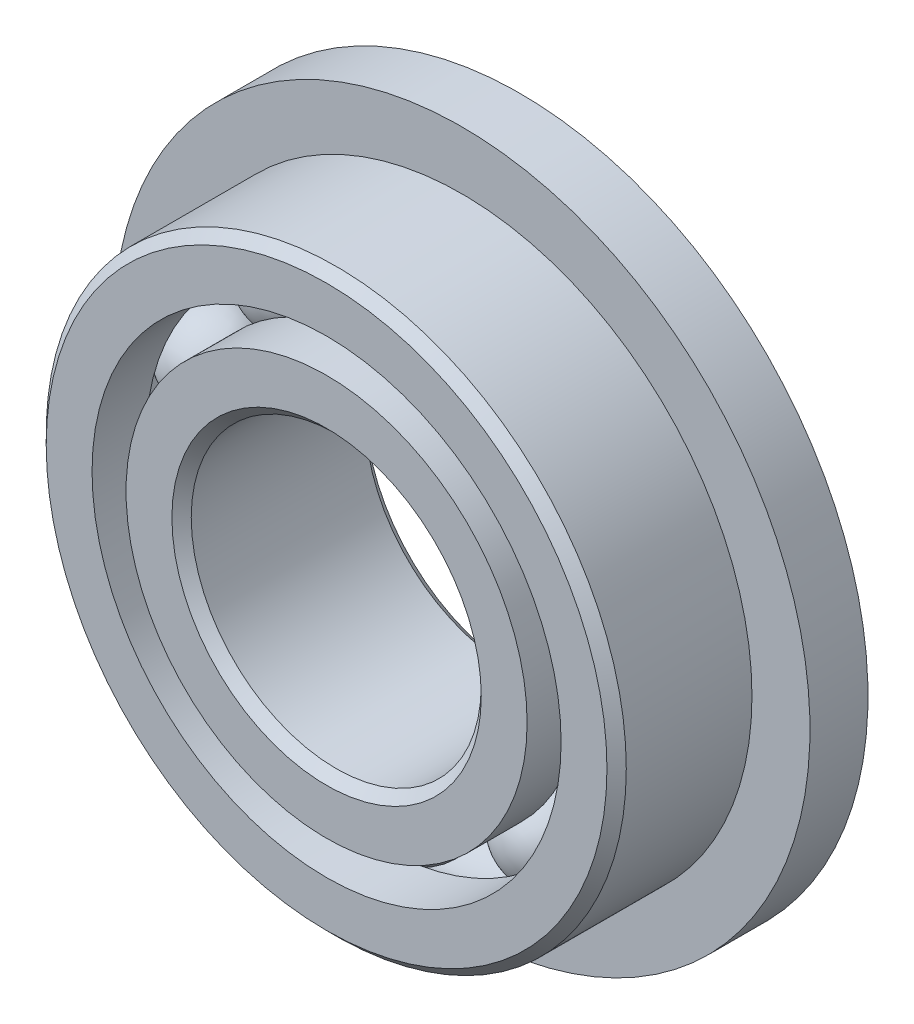
ISO-10303-21;
HEADER;
FILE_DESCRIPTION(('STEP AP214'),'2;1');
FILE_NAME('part.step','',(''),(''),'','','');
FILE_SCHEMA(('AUTOMOTIVE_DESIGN { 1 0 10303 214 1 1 1 1 }'));
ENDSEC;
DATA;
#1=APPLICATION_CONTEXT('core data for automotive mechanical design processes');
#2=APPLICATION_PROTOCOL_DEFINITION('international standard','automotive_design',2000,#1);
#3=PRODUCT_CONTEXT('',#1,'mechanical');
#4=PRODUCT('Part','Part','',(#3));
#5=PRODUCT_RELATED_PRODUCT_CATEGORY('part','',(#4));
#6=PRODUCT_DEFINITION_FORMATION('','',#4);
#7=PRODUCT_DEFINITION_CONTEXT('part definition',#1,'design');
#8=PRODUCT_DEFINITION('design','',#6,#7);
#9=PRODUCT_DEFINITION_SHAPE('','',#8);
#10=(LENGTH_UNIT() NAMED_UNIT(*) SI_UNIT(.MILLI.,.METRE.));
#11=(NAMED_UNIT(*) PLANE_ANGLE_UNIT() SI_UNIT($,.RADIAN.));
#12=(NAMED_UNIT(*) SI_UNIT($,.STERADIAN.) SOLID_ANGLE_UNIT());
#13=UNCERTAINTY_MEASURE_WITH_UNIT(LENGTH_MEASURE(1.E-05),#10,'distance_accuracy_value','');
#14=(GEOMETRIC_REPRESENTATION_CONTEXT(3) GLOBAL_UNCERTAINTY_ASSIGNED_CONTEXT((#13)) GLOBAL_UNIT_ASSIGNED_CONTEXT((#10,
#11,#12)) REPRESENTATION_CONTEXT('',''));
#15=CARTESIAN_POINT('',(0.,0.,0.));
#16=DIRECTION('',(0.,0.,1.));
#17=DIRECTION('',(1.,0.,0.));
#18=AXIS2_PLACEMENT_3D('',#15,#16,#17);
#19=CARTESIAN_POINT('',(-1.32251681765804,1.82028823734365,0.));
#20=DIRECTION('',(0.,0.,1.));
#21=DIRECTION('',(-0.587785252292462,0.809016994374955,0.));
#22=AXIS2_PLACEMENT_3D('',#19,#20,#21);
#23=SPHERICAL_SURFACE('',#22,0.477959208512381);
#24=CARTESIAN_POINT('',(-1.32251681765804,1.82028823734365,0.477959208512381));
#25=VERTEX_POINT('',#24);
#26=VERTEX_LOOP('',#25);
#27=FACE_BOUND('',#26,.T.);
#28=ADVANCED_FACE('F39',(#27),#23,.T.);
#29=CLOSED_SHELL('',(#28));
#30=MANIFOLD_SOLID_BREP('B2',#29);
#31=CARTESIAN_POINT('',(-2.13987716166409,0.695288237343656,0.));
#32=DIRECTION('',(0.,0.,1.));
#33=DIRECTION('',(-0.95105651629515,0.309016994374958,0.));
#34=AXIS2_PLACEMENT_3D('',#31,#32,#33);
#35=SPHERICAL_SURFACE('',#34,0.477959208512381);
#36=CARTESIAN_POINT('',(-2.13987716166409,0.695288237343656,0.477959208512381));
#37=VERTEX_POINT('',#36);
#38=VERTEX_LOOP('',#37);
#39=FACE_BOUND('',#38,.T.);
#40=ADVANCED_FACE('F59',(#39),#35,.T.);
#41=CLOSED_SHELL('',(#40));
#42=MANIFOLD_SOLID_BREP('B6',#41);
#43=CARTESIAN_POINT('',(-2.1398771616641,-0.695288237343611,0.));
#44=DIRECTION('',(0.,0.,1.));
#45=DIRECTION('',(-0.951056516295157,-0.309016994374938,0.));
#46=AXIS2_PLACEMENT_3D('',#43,#44,#45);
#47=SPHERICAL_SURFACE('',#46,0.477959208512381);
#48=CARTESIAN_POINT('',(-2.1398771616641,-0.695288237343611,0.477959208512381));
#49=VERTEX_POINT('',#48);
#50=VERTEX_LOOP('',#49);
#51=FACE_BOUND('',#50,.T.);
#52=ADVANCED_FACE('F79',(#51),#47,.T.);
#53=CLOSED_SHELL('',(#52));
#54=MANIFOLD_SOLID_BREP('B35',#53);
#55=CARTESIAN_POINT('',(-1.32251681765808,-1.82028823734362,0.));
#56=DIRECTION('',(0.,0.,1.));
#57=DIRECTION('',(-0.58778525229248,-0.809016994374942,0.));
#58=AXIS2_PLACEMENT_3D('',#55,#56,#57);
#59=SPHERICAL_SURFACE('',#58,0.477959208512381);
#60=CARTESIAN_POINT('',(-1.32251681765808,-1.82028823734362,0.477959208512381));
#61=VERTEX_POINT('',#60);
#62=VERTEX_LOOP('',#61);
#63=FACE_BOUND('',#62,.T.);
#64=ADVANCED_FACE('F99',(#63),#59,.T.);
#65=CLOSED_SHELL('',(#64));
#66=MANIFOLD_SOLID_BREP('B55',#65);
#67=CARTESIAN_POINT('',(0.,-2.25,0.));
#68=DIRECTION('',(0.,0.,1.));
#69=DIRECTION('',(0.,-1.,0.));
#70=AXIS2_PLACEMENT_3D('',#67,#68,#69);
#71=SPHERICAL_SURFACE('',#70,0.477959208512381);
#72=CARTESIAN_POINT('',(0.,-2.25,0.477959208512381));
#73=VERTEX_POINT('',#72);
#74=VERTEX_LOOP('',#73);
#75=FACE_BOUND('',#74,.T.);
#76=ADVANCED_FACE('F119',(#75),#71,.T.);
#77=CLOSED_SHELL('',(#76));
#78=MANIFOLD_SOLID_BREP('B75',#77);
#79=CARTESIAN_POINT('',(1.32251681765805,-1.82028823734364,0.));
#80=DIRECTION('',(0.,0.,1.));
#81=DIRECTION('',(0.587785252292469,-0.809016994374951,0.));
#82=AXIS2_PLACEMENT_3D('',#79,#80,#81);
#83=SPHERICAL_SURFACE('',#82,0.477959208512381);
#84=CARTESIAN_POINT('',(1.32251681765805,-1.82028823734364,0.477959208512381));
#85=VERTEX_POINT('',#84);
#86=VERTEX_LOOP('',#85);
#87=FACE_BOUND('',#86,.T.);
#88=ADVANCED_FACE('F139',(#87),#83,.T.);
#89=CLOSED_SHELL('',(#88));
#90=MANIFOLD_SOLID_BREP('B95',#89);
#91=CARTESIAN_POINT('',(2.13987716166409,-0.695288237343641,0.));
#92=DIRECTION('',(0.,0.,1.));
#93=DIRECTION('',(0.951056516295152,-0.309016994374952,0.));
#94=AXIS2_PLACEMENT_3D('',#91,#92,#93);
#95=SPHERICAL_SURFACE('',#94,0.477959208512381);
#96=CARTESIAN_POINT('',(2.13987716166409,-0.695288237343641,0.477959208512381));
#97=VERTEX_POINT('',#96);
#98=VERTEX_LOOP('',#97);
#99=FACE_BOUND('',#98,.T.);
#100=ADVANCED_FACE('F159',(#99),#95,.T.);
#101=CLOSED_SHELL('',(#100));
#102=MANIFOLD_SOLID_BREP('B115',#101);
#103=CARTESIAN_POINT('',(2.1398771616641,0.695288237343626,0.));
#104=DIRECTION('',(0.,0.,1.));
#105=DIRECTION('',(0.951056516295155,0.309016994374945,0.));
#106=AXIS2_PLACEMENT_3D('',#103,#104,#105);
#107=SPHERICAL_SURFACE('',#106,0.477959208512381);
#108=CARTESIAN_POINT('',(2.1398771616641,0.695288237343626,0.477959208512381));
#109=VERTEX_POINT('',#108);
#110=VERTEX_LOOP('',#109);
#111=FACE_BOUND('',#110,.T.);
#112=ADVANCED_FACE('F179',(#111),#107,.T.);
#113=CLOSED_SHELL('',(#112));
#114=MANIFOLD_SOLID_BREP('B135',#113);
#115=CARTESIAN_POINT('',(1.32251681765807,1.82028823734363,0.));
#116=DIRECTION('',(0.,0.,1.));
#117=DIRECTION('',(0.587785252292474,0.809016994374947,0.));
#118=AXIS2_PLACEMENT_3D('',#115,#116,#117);
#119=SPHERICAL_SURFACE('',#118,0.477959208512381);
#120=CARTESIAN_POINT('',(1.32251681765807,1.82028823734363,0.477959208512381));
#121=VERTEX_POINT('',#120);
#122=VERTEX_LOOP('',#121);
#123=FACE_BOUND('',#122,.T.);
#124=ADVANCED_FACE('F199',(#123),#119,.T.);
#125=CLOSED_SHELL('',(#124));
#126=MANIFOLD_SOLID_BREP('B155',#125);
#127=CARTESIAN_POINT('',(0.,2.25,0.));
#128=DIRECTION('',(0.,0.,1.));
#129=DIRECTION('',(0.,1.,0.));
#130=AXIS2_PLACEMENT_3D('',#127,#128,#129);
#131=SPHERICAL_SURFACE('',#130,0.477959208512381);
#132=CARTESIAN_POINT('',(0.,2.25,0.477959208512381));
#133=VERTEX_POINT('',#132);
#134=VERTEX_LOOP('',#133);
#135=FACE_BOUND('',#134,.T.);
#136=ADVANCED_FACE('F221',(#135),#131,.T.);
#137=CLOSED_SHELL('',(#136));
#138=MANIFOLD_SOLID_BREP('B175',#137);
#139=CARTESIAN_POINT('',(0.,2.07417582417582,1.));
#140=DIRECTION('',(0.,0.,-1.));
#141=DIRECTION('',(-1.,0.,0.));
#142=AXIS2_PLACEMENT_3D('',#139,#140,#141);
#143=PLANE('',#142);
#144=CARTESIAN_POINT('',(0.,0.,1.));
#145=DIRECTION('',(0.,0.,1.));
#146=DIRECTION('',(1.,0.,0.));
#147=AXIS2_PLACEMENT_3D('',#144,#145,#146);
#148=CIRCLE('',#147,1.6);
#149=CARTESIAN_POINT('',(1.6,0.,1.));
#150=VERTEX_POINT('',#149);
#151=EDGE_CURVE('E268',#150,#150,#148,.T.);
#152=ORIENTED_EDGE('',*,*,#151,.F.);
#153=EDGE_LOOP('',(#152));
#154=FACE_BOUND('',#153,.T.);
#155=CARTESIAN_POINT('',(0.,0.,1.));
#156=DIRECTION('',(0.,0.,1.));
#157=DIRECTION('',(1.,0.,0.));
#158=AXIS2_PLACEMENT_3D('',#155,#156,#157);
#159=CIRCLE('',#158,2.07417582417582);
#160=CARTESIAN_POINT('',(2.07417582417582,0.,1.));
#161=VERTEX_POINT('',#160);
#162=EDGE_CURVE('E220',#161,#161,#159,.T.);
#163=ORIENTED_EDGE('',*,*,#162,.T.);
#164=EDGE_LOOP('',(#163));
#165=FACE_BOUND('',#164,.T.);
#166=ADVANCED_FACE('F240',(#154,#165),#143,.F.);
#167=CARTESIAN_POINT('',(0.,0.,1.));
#168=DIRECTION('',(0.,0.,1.));
#169=DIRECTION('',(1.,0.,0.));
#170=AXIS2_PLACEMENT_3D('',#167,#168,#169);
#171=CYLINDRICAL_SURFACE('',#170,2.07417582417582);
#172=ORIENTED_EDGE('',*,*,#162,.F.);
#173=EDGE_LOOP('',(#172));
#174=FACE_BOUND('',#173,.T.);
#175=CARTESIAN_POINT('',(0.,0.,0.444444444444444));
#176=DIRECTION('',(0.,0.,1.));
#177=DIRECTION('',(1.,0.,0.));
#178=AXIS2_PLACEMENT_3D('',#175,#176,#177);
#179=CIRCLE('',#178,2.07417582417582);
#180=CARTESIAN_POINT('',(2.07417582417582,0.,0.444444444444444));
#181=VERTEX_POINT('',#180);
#182=EDGE_CURVE('E246',#181,#181,#179,.T.);
#183=ORIENTED_EDGE('',*,*,#182,.T.);
#184=EDGE_LOOP('',(#183));
#185=FACE_BOUND('',#184,.T.);
#186=ADVANCED_FACE('F275',(#174,#185),#171,.T.);
#187=CARTESIAN_POINT('',(0.,0.,0.));
#188=DIRECTION('',(0.,0.,1.));
#189=DIRECTION('',(1.,0.,0.));
#190=AXIS2_PLACEMENT_3D('',#187,#188,#189);
#191=TOROIDAL_SURFACE('',#190,2.25,0.47795920851238);
#192=ORIENTED_EDGE('',*,*,#182,.F.);
#193=EDGE_LOOP('',(#192));
#194=FACE_BOUND('',#193,.T.);
#195=CARTESIAN_POINT('',(0.,0.,-0.444444444444445));
#196=DIRECTION('',(0.,0.,1.));
#197=DIRECTION('',(1.,0.,0.));
#198=AXIS2_PLACEMENT_3D('',#195,#196,#197);
#199=CIRCLE('',#198,2.07417582417582);
#200=CARTESIAN_POINT('',(2.07417582417582,0.,-0.444444444444445));
#201=VERTEX_POINT('',#200);
#202=EDGE_CURVE('E250',#201,#201,#199,.T.);
#203=ORIENTED_EDGE('',*,*,#202,.T.);
#204=EDGE_LOOP('',(#203));
#205=FACE_BOUND('',#204,.T.);
#206=ADVANCED_FACE('F279',(#194,#205),#191,.F.);
#207=CARTESIAN_POINT('',(0.,0.,1.));
#208=DIRECTION('',(0.,0.,1.));
#209=DIRECTION('',(1.,0.,0.));
#210=AXIS2_PLACEMENT_3D('',#207,#208,#209);
#211=CYLINDRICAL_SURFACE('',#210,2.07417582417582);
#212=ORIENTED_EDGE('',*,*,#202,.F.);
#213=EDGE_LOOP('',(#212));
#214=FACE_BOUND('',#213,.T.);
#215=CARTESIAN_POINT('',(0.,0.,-1.));
#216=DIRECTION('',(0.,0.,1.));
#217=DIRECTION('',(1.,0.,0.));
#218=AXIS2_PLACEMENT_3D('',#215,#216,#217);
#219=CIRCLE('',#218,2.07417582417582);
#220=CARTESIAN_POINT('',(2.07417582417582,0.,-1.));
#221=VERTEX_POINT('',#220);
#222=EDGE_CURVE('E254',#221,#221,#219,.T.);
#223=ORIENTED_EDGE('',*,*,#222,.T.);
#224=EDGE_LOOP('',(#223));
#225=FACE_BOUND('',#224,.T.);
#226=ADVANCED_FACE('F284',(#214,#225),#211,.T.);
#227=CARTESIAN_POINT('',(0.,1.6,-1.));
#228=DIRECTION('',(0.,0.,1.));
#229=DIRECTION('',(1.,0.,0.));
#230=AXIS2_PLACEMENT_3D('',#227,#228,#229);
#231=PLANE('',#230);
#232=ORIENTED_EDGE('',*,*,#222,.F.);
#233=EDGE_LOOP('',(#232));
#234=FACE_BOUND('',#233,.T.);
#235=CARTESIAN_POINT('',(0.,0.,-1.));
#236=DIRECTION('',(0.,0.,1.));
#237=DIRECTION('',(1.,0.,0.));
#238=AXIS2_PLACEMENT_3D('',#235,#236,#237);
#239=CIRCLE('',#238,1.6);
#240=CARTESIAN_POINT('',(1.6,0.,-1.));
#241=VERTEX_POINT('',#240);
#242=EDGE_CURVE('E259',#241,#241,#239,.T.);
#243=ORIENTED_EDGE('',*,*,#242,.T.);
#244=EDGE_LOOP('',(#243));
#245=FACE_BOUND('',#244,.T.);
#246=ADVANCED_FACE('F290',(#234,#245),#231,.F.);
#247=CARTESIAN_POINT('',(0.,0.,-0.900000000000002));
#248=DIRECTION('',(0.,0.,-1.));
#249=DIRECTION('',(-1.,0.,0.));
#250=AXIS2_PLACEMENT_3D('',#247,#248,#249);
#251=CONICAL_SURFACE('',#250,1.5,0.785398163397455);
#252=ORIENTED_EDGE('',*,*,#242,.F.);
#253=EDGE_LOOP('',(#252));
#254=FACE_BOUND('',#253,.T.);
#255=CARTESIAN_POINT('',(0.,0.,-0.900000000000002));
#256=DIRECTION('',(0.,0.,1.));
#257=DIRECTION('',(1.,0.,0.));
#258=AXIS2_PLACEMENT_3D('',#255,#256,#257);
#259=CIRCLE('',#258,1.5);
#260=CARTESIAN_POINT('',(1.5,0.,-0.900000000000002));
#261=VERTEX_POINT('',#260);
#262=EDGE_CURVE('E262',#261,#261,#259,.T.);
#263=ORIENTED_EDGE('',*,*,#262,.T.);
#264=EDGE_LOOP('',(#263));
#265=FACE_BOUND('',#264,.T.);
#266=ADVANCED_FACE('F294',(#254,#265),#251,.F.);
#267=CARTESIAN_POINT('',(0.,0.,1.));
#268=DIRECTION('',(0.,0.,1.));
#269=DIRECTION('',(1.,0.,0.));
#270=AXIS2_PLACEMENT_3D('',#267,#268,#269);
#271=CYLINDRICAL_SURFACE('',#270,1.5);
#272=ORIENTED_EDGE('',*,*,#262,.F.);
#273=EDGE_LOOP('',(#272));
#274=FACE_BOUND('',#273,.T.);
#275=CARTESIAN_POINT('',(0.,0.,0.900000000000002));
#276=DIRECTION('',(0.,0.,1.));
#277=DIRECTION('',(1.,0.,0.));
#278=AXIS2_PLACEMENT_3D('',#275,#276,#277);
#279=CIRCLE('',#278,1.5);
#280=CARTESIAN_POINT('',(1.5,0.,0.900000000000002));
#281=VERTEX_POINT('',#280);
#282=EDGE_CURVE('E265',#281,#281,#279,.T.);
#283=ORIENTED_EDGE('',*,*,#282,.T.);
#284=EDGE_LOOP('',(#283));
#285=FACE_BOUND('',#284,.T.);
#286=ADVANCED_FACE('F298',(#274,#285),#271,.F.);
#287=CARTESIAN_POINT('',(0.,0.,1.));
#288=DIRECTION('',(0.,0.,1.));
#289=DIRECTION('',(1.,0.,0.));
#290=AXIS2_PLACEMENT_3D('',#287,#288,#289);
#291=CONICAL_SURFACE('',#290,1.6,0.785398163397442);
#292=ORIENTED_EDGE('',*,*,#282,.F.);
#293=EDGE_LOOP('',(#292));
#294=FACE_BOUND('',#293,.T.);
#295=ORIENTED_EDGE('',*,*,#151,.T.);
#296=EDGE_LOOP('',(#295));
#297=FACE_BOUND('',#296,.T.);
#298=ADVANCED_FACE('F272',(#294,#297),#291,.F.);
#299=CLOSED_SHELL('',(#166,#186,#206,#226,#246,#266,#286,#298));
#300=MANIFOLD_SOLID_BREP('B195',#299);
#301=CARTESIAN_POINT('',(0.,0.,0.9));
#302=DIRECTION('',(0.,0.,-1.));
#303=DIRECTION('',(-1.,0.,0.));
#304=AXIS2_PLACEMENT_3D('',#301,#302,#303);
#305=CONICAL_SURFACE('',#304,3.,0.785398163397445);
#306=CARTESIAN_POINT('',(0.,0.,1.));
#307=DIRECTION('',(0.,0.,1.));
#308=DIRECTION('',(1.,0.,0.));
#309=AXIS2_PLACEMENT_3D('',#306,#307,#308);
#310=CIRCLE('',#309,2.9);
#311=CARTESIAN_POINT('',(2.9,0.,1.));
#312=VERTEX_POINT('',#311);
#313=EDGE_CURVE('E380',#312,#312,#310,.T.);
#314=ORIENTED_EDGE('',*,*,#313,.F.);
#315=EDGE_LOOP('',(#314));
#316=FACE_BOUND('',#315,.T.);
#317=CARTESIAN_POINT('',(0.,0.,0.9));
#318=DIRECTION('',(0.,0.,1.));
#319=DIRECTION('',(1.,0.,0.));
#320=AXIS2_PLACEMENT_3D('',#317,#318,#319);
#321=CIRCLE('',#320,3.);
#322=CARTESIAN_POINT('',(3.,0.,0.9));
#323=VERTEX_POINT('',#322);
#324=EDGE_CURVE('E239',#323,#323,#321,.T.);
#325=ORIENTED_EDGE('',*,*,#324,.T.);
#326=EDGE_LOOP('',(#325));
#327=FACE_BOUND('',#326,.T.);
#328=ADVANCED_FACE('F361',(#316,#327),#305,.T.);
#329=CARTESIAN_POINT('',(0.,0.,1.));
#330=DIRECTION('',(0.,0.,1.));
#331=DIRECTION('',(1.,0.,0.));
#332=AXIS2_PLACEMENT_3D('',#329,#330,#331);
#333=CYLINDRICAL_SURFACE('',#332,3.);
#334=CARTESIAN_POINT('',(0.,0.,-0.4));
#335=DIRECTION('',(0.,0.,1.));
#336=DIRECTION('',(1.,0.,0.));
#337=AXIS2_PLACEMENT_3D('',#334,#335,#336);
#338=CIRCLE('',#337,3.);
#339=CARTESIAN_POINT('',(3.,0.,-0.4));
#340=VERTEX_POINT('',#339);
#341=EDGE_CURVE('E383',#340,#340,#338,.T.);
#342=ORIENTED_EDGE('',*,*,#341,.T.);
#343=EDGE_LOOP('',(#342));
#344=FACE_BOUND('',#343,.T.);
#345=ORIENTED_EDGE('',*,*,#324,.F.);
#346=EDGE_LOOP('',(#345));
#347=FACE_BOUND('',#346,.T.);
#348=ADVANCED_FACE('F417',(#344,#347),#333,.T.);
#349=CARTESIAN_POINT('',(0.,0.,0.));
#350=DIRECTION('',(0.,0.,1.));
#351=DIRECTION('',(1.,0.,0.));
#352=AXIS2_PLACEMENT_3D('',#349,#350,#351);
#353=TOROIDAL_SURFACE('',#352,2.25,0.477959208512381);
#354=CARTESIAN_POINT('',(0.,0.,-0.4));
#355=DIRECTION('',(0.,0.,1.));
#356=DIRECTION('',(1.,0.,0.));
#357=AXIS2_PLACEMENT_3D('',#354,#355,#356);
#358=CIRCLE('',#357,2.51161996292673);
#359=CARTESIAN_POINT('',(2.51161996292673,0.,-0.4));
#360=VERTEX_POINT('',#359);
#361=EDGE_CURVE('E364',#360,#360,#358,.F.);
#362=ORIENTED_EDGE('',*,*,#361,.T.);
#363=EDGE_LOOP('',(#362));
#364=FACE_BOUND('',#363,.T.);
#365=CARTESIAN_POINT('',(0.,0.,0.444444444444444));
#366=DIRECTION('',(0.,0.,1.));
#367=DIRECTION('',(1.,0.,0.));
#368=AXIS2_PLACEMENT_3D('',#365,#366,#367);
#369=CIRCLE('',#368,2.42582417582418);
#370=CARTESIAN_POINT('',(2.42582417582418,0.,0.444444444444444));
#371=VERTEX_POINT('',#370);
#372=EDGE_CURVE('E372',#371,#371,#369,.T.);
#373=ORIENTED_EDGE('',*,*,#372,.T.);
#374=EDGE_LOOP('',(#373));
#375=FACE_BOUND('',#374,.T.);
#376=ADVANCED_FACE('F422',(#364,#375),#353,.F.);
#377=CARTESIAN_POINT('',(0.,0.,1.));
#378=DIRECTION('',(0.,0.,1.));
#379=DIRECTION('',(1.,0.,0.));
#380=AXIS2_PLACEMENT_3D('',#377,#378,#379);
#381=CYLINDRICAL_SURFACE('',#380,2.42582417582418);
#382=ORIENTED_EDGE('',*,*,#372,.F.);
#383=EDGE_LOOP('',(#382));
#384=FACE_BOUND('',#383,.T.);
#385=CARTESIAN_POINT('',(0.,0.,1.));
#386=DIRECTION('',(0.,0.,1.));
#387=DIRECTION('',(1.,0.,0.));
#388=AXIS2_PLACEMENT_3D('',#385,#386,#387);
#389=CIRCLE('',#388,2.42582417582418);
#390=CARTESIAN_POINT('',(2.42582417582418,0.,1.));
#391=VERTEX_POINT('',#390);
#392=EDGE_CURVE('E377',#391,#391,#389,.T.);
#393=ORIENTED_EDGE('',*,*,#392,.T.);
#394=EDGE_LOOP('',(#393));
#395=FACE_BOUND('',#394,.T.);
#396=ADVANCED_FACE('F428',(#384,#395),#381,.F.);
#397=CARTESIAN_POINT('',(0.,2.9,1.));
#398=DIRECTION('',(0.,0.,-1.));
#399=DIRECTION('',(-1.,0.,0.));
#400=AXIS2_PLACEMENT_3D('',#397,#398,#399);
#401=PLANE('',#400);
#402=ORIENTED_EDGE('',*,*,#392,.F.);
#403=EDGE_LOOP('',(#402));
#404=FACE_BOUND('',#403,.T.);
#405=ORIENTED_EDGE('',*,*,#313,.T.);
#406=EDGE_LOOP('',(#405));
#407=FACE_BOUND('',#406,.T.);
#408=ADVANCED_FACE('F426',(#404,#407),#401,.F.);
#409=CARTESIAN_POINT('',(0.,2.42582417582418,-0.4));
#410=DIRECTION('',(0.,0.,1.));
#411=DIRECTION('',(1.,0.,0.));
#412=AXIS2_PLACEMENT_3D('',#409,#410,#411);
#413=PLANE('',#412);
#414=CARTESIAN_POINT('',(0.,0.,-0.4));
#415=DIRECTION('',(0.,0.,-1.));
#416=DIRECTION('',(-1.,0.,0.));
#417=AXIS2_PLACEMENT_3D('',#414,#415,#416);
#418=CIRCLE('',#417,2.42582417582418);
#419=CARTESIAN_POINT('',(-2.42582417582418,0.,-0.4));
#420=VERTEX_POINT('',#419);
#421=EDGE_CURVE('E392',#420,#420,#418,.T.);
#422=ORIENTED_EDGE('',*,*,#421,.T.);
#423=EDGE_LOOP('',(#422));
#424=FACE_BOUND('',#423,.T.);
#425=ORIENTED_EDGE('',*,*,#361,.F.);
#426=EDGE_LOOP('',(#425));
#427=FACE_BOUND('',#426,.T.);
#428=ADVANCED_FACE('F396',(#424,#427),#413,.T.);
#429=CARTESIAN_POINT('',(0.,0.,-0.4));
#430=DIRECTION('',(0.,0.,-1.));
#431=DIRECTION('',(-1.,0.,0.));
#432=AXIS2_PLACEMENT_3D('',#429,#430,#431);
#433=CIRCLE('',#432,3.6);
#434=CARTESIAN_POINT('',(-3.6,0.,-0.4));
#435=VERTEX_POINT('',#434);
#436=EDGE_CURVE('E389',#435,#435,#433,.T.);
#437=ORIENTED_EDGE('',*,*,#436,.F.);
#438=EDGE_LOOP('',(#437));
#439=FACE_BOUND('',#438,.T.);
#440=ORIENTED_EDGE('',*,*,#341,.F.);
#441=EDGE_LOOP('',(#440));
#442=FACE_BOUND('',#441,.T.);
#443=ADVANCED_FACE('F411',(#439,#442),#413,.T.);
#444=CARTESIAN_POINT('',(0.,0.,-1.));
#445=DIRECTION('',(0.,0.,-1.));
#446=DIRECTION('',(-1.,0.,0.));
#447=AXIS2_PLACEMENT_3D('',#444,#445,#446);
#448=CYLINDRICAL_SURFACE('',#447,3.6);
#449=ORIENTED_EDGE('',*,*,#436,.T.);
#450=EDGE_LOOP('',(#449));
#451=FACE_BOUND('',#450,.T.);
#452=CARTESIAN_POINT('',(0.,0.,-1.));
#453=DIRECTION('',(0.,0.,-1.));
#454=DIRECTION('',(-1.,0.,0.));
#455=AXIS2_PLACEMENT_3D('',#452,#453,#454);
#456=CIRCLE('',#455,3.6);
#457=CARTESIAN_POINT('',(-3.6,0.,-1.));
#458=VERTEX_POINT('',#457);
#459=EDGE_CURVE('E386',#458,#458,#456,.T.);
#460=ORIENTED_EDGE('',*,*,#459,.F.);
#461=EDGE_LOOP('',(#460));
#462=FACE_BOUND('',#461,.T.);
#463=ADVANCED_FACE('F402',(#451,#462),#448,.T.);
#464=CARTESIAN_POINT('',(0.,0.,1.));
#465=DIRECTION('',(0.,0.,1.));
#466=DIRECTION('',(1.,0.,0.));
#467=AXIS2_PLACEMENT_3D('',#464,#465,#466);
#468=CYLINDRICAL_SURFACE('',#467,2.42582417582418);
#469=CARTESIAN_POINT('',(0.,0.,-1.));
#470=DIRECTION('',(0.,0.,1.));
#471=DIRECTION('',(1.,0.,0.));
#472=AXIS2_PLACEMENT_3D('',#469,#470,#471);
#473=CIRCLE('',#472,2.42582417582418);
#474=CARTESIAN_POINT('',(2.42582417582418,0.,-1.));
#475=VERTEX_POINT('',#474);
#476=EDGE_CURVE('E368',#475,#475,#473,.T.);
#477=ORIENTED_EDGE('',*,*,#476,.F.);
#478=EDGE_LOOP('',(#477));
#479=FACE_BOUND('',#478,.T.);
#480=ORIENTED_EDGE('',*,*,#421,.F.);
#481=EDGE_LOOP('',(#480));
#482=FACE_BOUND('',#481,.T.);
#483=ADVANCED_FACE('F399',(#479,#482),#468,.F.);
#484=CARTESIAN_POINT('',(0.,2.9,-1.));
#485=DIRECTION('',(0.,0.,1.));
#486=DIRECTION('',(1.,0.,0.));
#487=AXIS2_PLACEMENT_3D('',#484,#485,#486);
#488=PLANE('',#487);
#489=ORIENTED_EDGE('',*,*,#476,.T.);
#490=EDGE_LOOP('',(#489));
#491=FACE_BOUND('',#490,.T.);
#492=ORIENTED_EDGE('',*,*,#459,.T.);
#493=EDGE_LOOP('',(#492));
#494=FACE_BOUND('',#493,.T.);
#495=ADVANCED_FACE('F401',(#491,#494),#488,.F.);
#496=CLOSED_SHELL('',(#328,#348,#376,#396,#408,#428,#443,#463,#483,#495));
#497=MANIFOLD_SOLID_BREP('B215',#496);
#498=ADVANCED_BREP_SHAPE_REPRESENTATION('',(#18,#30,#42,#54,#66,#78,#90,#102,#114,#126,#138,
#300,#497),#14);
#499=SHAPE_DEFINITION_REPRESENTATION(#9,#498);
ENDSEC;
END-ISO-10303-21;
